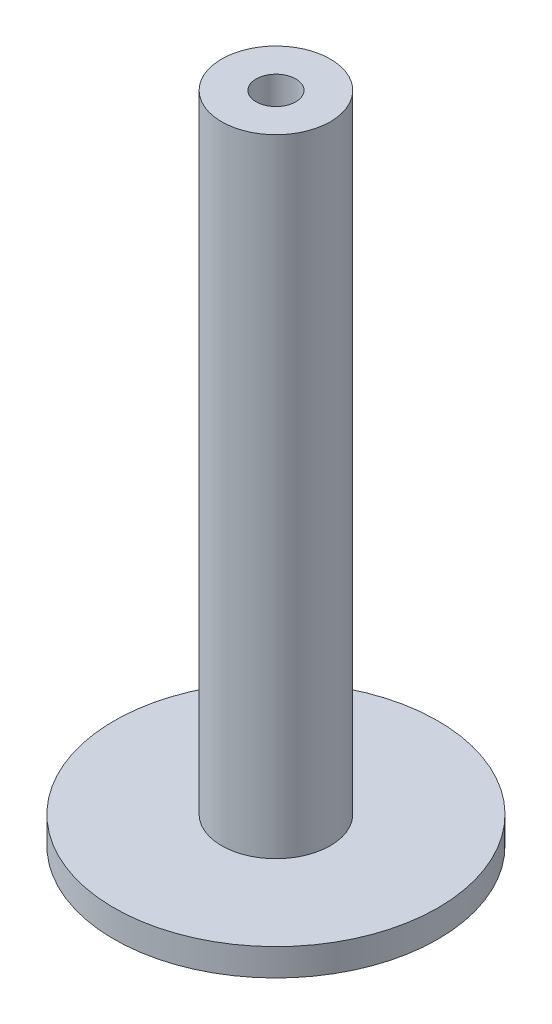
ISO-10303-21;
HEADER;
FILE_DESCRIPTION(('STEP AP214'),'2;1');
FILE_NAME('part.step','',(''),(''),'','','');
FILE_SCHEMA(('AUTOMOTIVE_DESIGN { 1 0 10303 214 1 1 1 1 }'));
ENDSEC;
DATA;
#1=APPLICATION_CONTEXT('core data for automotive mechanical design processes');
#2=APPLICATION_PROTOCOL_DEFINITION('international standard','automotive_design',2000,#1);
#3=PRODUCT_CONTEXT('',#1,'mechanical');
#4=PRODUCT('Part','Part','',(#3));
#5=PRODUCT_RELATED_PRODUCT_CATEGORY('part','',(#4));
#6=PRODUCT_DEFINITION_FORMATION('','',#4);
#7=PRODUCT_DEFINITION_CONTEXT('part definition',#1,'design');
#8=PRODUCT_DEFINITION('design','',#6,#7);
#9=PRODUCT_DEFINITION_SHAPE('','',#8);
#10=(LENGTH_UNIT() NAMED_UNIT(*) SI_UNIT(.MILLI.,.METRE.));
#11=(NAMED_UNIT(*) PLANE_ANGLE_UNIT() SI_UNIT($,.RADIAN.));
#12=(NAMED_UNIT(*) SI_UNIT($,.STERADIAN.) SOLID_ANGLE_UNIT());
#13=UNCERTAINTY_MEASURE_WITH_UNIT(LENGTH_MEASURE(1.E-05),#10,'distance_accuracy_value','');
#14=(GEOMETRIC_REPRESENTATION_CONTEXT(3) GLOBAL_UNCERTAINTY_ASSIGNED_CONTEXT((#13)) GLOBAL_UNIT_ASSIGNED_CONTEXT((#10,
#11,#12)) REPRESENTATION_CONTEXT('',''));
#15=CARTESIAN_POINT('',(0.,0.,0.));
#16=DIRECTION('',(0.,0.,1.));
#17=DIRECTION('',(1.,0.,0.));
#18=AXIS2_PLACEMENT_3D('',#15,#16,#17);
#19=CARTESIAN_POINT('',(0.,1.3,0.));
#20=DIRECTION('',(0.,1.,0.));
#21=DIRECTION('',(0.,0.,1.));
#22=AXIS2_PLACEMENT_3D('',#19,#20,#21);
#23=PLANE('',#22);
#24=CARTESIAN_POINT('',(0.,1.3,0.));
#25=DIRECTION('',(0.,1.,0.));
#26=DIRECTION('',(1.,0.,0.));
#27=AXIS2_PLACEMENT_3D('',#24,#25,#26);
#28=CIRCLE('',#27,7.75);
#29=CARTESIAN_POINT('',(7.75,1.3,0.));
#30=VERTEX_POINT('',#29);
#31=EDGE_CURVE('E11',#30,#30,#28,.T.);
#32=ORIENTED_EDGE('',*,*,#31,.T.);
#33=EDGE_LOOP('',(#32));
#34=FACE_BOUND('',#33,.T.);
#35=CARTESIAN_POINT('',(0.,1.3,0.));
#36=DIRECTION('',(0.,1.,0.));
#37=DIRECTION('',(1.,0.,0.));
#38=AXIS2_PLACEMENT_3D('',#35,#36,#37);
#39=CIRCLE('',#38,2.6);
#40=CARTESIAN_POINT('',(2.6,1.3,0.));
#41=VERTEX_POINT('',#40);
#42=EDGE_CURVE('E63',#41,#41,#39,.T.);
#43=ORIENTED_EDGE('',*,*,#42,.F.);
#44=EDGE_LOOP('',(#43));
#45=FACE_BOUND('',#44,.T.);
#46=ADVANCED_FACE('F47',(#34,#45),#23,.T.);
#47=CARTESIAN_POINT('',(0.,0.,0.));
#48=DIRECTION('',(0.,1.,0.));
#49=DIRECTION('',(0.,0.,1.));
#50=AXIS2_PLACEMENT_3D('',#47,#48,#49);
#51=PLANE('',#50);
#52=CARTESIAN_POINT('',(0.,0.,0.));
#53=DIRECTION('',(0.,1.,0.));
#54=DIRECTION('',(1.,0.,0.));
#55=AXIS2_PLACEMENT_3D('',#52,#53,#54);
#56=CIRCLE('',#55,7.75);
#57=CARTESIAN_POINT('',(7.75,0.,0.));
#58=VERTEX_POINT('',#57);
#59=EDGE_CURVE('E51',#58,#58,#56,.T.);
#60=ORIENTED_EDGE('',*,*,#59,.F.);
#61=EDGE_LOOP('',(#60));
#62=FACE_BOUND('',#61,.T.);
#63=CARTESIAN_POINT('',(0.,0.,0.));
#64=DIRECTION('',(0.,1.,0.));
#65=DIRECTION('',(0.,0.,1.));
#66=AXIS2_PLACEMENT_3D('',#63,#64,#65);
#67=CIRCLE('',#66,0.95);
#68=CARTESIAN_POINT('',(0.,0.,0.95));
#69=VERTEX_POINT('',#68);
#70=EDGE_CURVE('E58',#69,#69,#67,.T.);
#71=ORIENTED_EDGE('',*,*,#70,.T.);
#72=EDGE_LOOP('',(#71));
#73=FACE_BOUND('',#72,.T.);
#74=ADVANCED_FACE('F88',(#62,#73),#51,.F.);
#75=CARTESIAN_POINT('',(0.,1.3,0.));
#76=DIRECTION('',(0.,-1.,0.));
#77=DIRECTION('',(0.,0.,-1.));
#78=AXIS2_PLACEMENT_3D('',#75,#76,#77);
#79=CYLINDRICAL_SURFACE('',#78,7.75);
#80=ORIENTED_EDGE('',*,*,#31,.F.);
#81=EDGE_LOOP('',(#80));
#82=FACE_BOUND('',#81,.T.);
#83=ORIENTED_EDGE('',*,*,#59,.T.);
#84=EDGE_LOOP('',(#83));
#85=FACE_BOUND('',#84,.T.);
#86=ADVANCED_FACE('F49',(#82,#85),#79,.T.);
#87=CARTESIAN_POINT('',(0.,1.3,0.));
#88=DIRECTION('',(0.,-1.,0.));
#89=DIRECTION('',(0.,0.,-1.));
#90=AXIS2_PLACEMENT_3D('',#87,#88,#89);
#91=CYLINDRICAL_SURFACE('',#90,0.95);
#92=ORIENTED_EDGE('',*,*,#70,.F.);
#93=EDGE_LOOP('',(#92));
#94=FACE_BOUND('',#93,.T.);
#95=CARTESIAN_POINT('',(0.,31.3,0.));
#96=DIRECTION('',(0.,1.,0.));
#97=DIRECTION('',(0.,0.,1.));
#98=AXIS2_PLACEMENT_3D('',#95,#96,#97);
#99=CIRCLE('',#98,0.95);
#100=CARTESIAN_POINT('',(0.,31.3,0.95));
#101=VERTEX_POINT('',#100);
#102=EDGE_CURVE('E66',#101,#101,#99,.T.);
#103=ORIENTED_EDGE('',*,*,#102,.T.);
#104=EDGE_LOOP('',(#103));
#105=FACE_BOUND('',#104,.T.);
#106=ADVANCED_FACE('F72',(#94,#105),#91,.F.);
#107=CARTESIAN_POINT('',(0.,31.3,0.));
#108=DIRECTION('',(0.,1.,0.));
#109=DIRECTION('',(0.,0.,1.));
#110=AXIS2_PLACEMENT_3D('',#107,#108,#109);
#111=PLANE('',#110);
#112=CARTESIAN_POINT('',(0.,31.3,0.));
#113=DIRECTION('',(0.,1.,0.));
#114=DIRECTION('',(1.,0.,0.));
#115=AXIS2_PLACEMENT_3D('',#112,#113,#114);
#116=CIRCLE('',#115,2.6);
#117=CARTESIAN_POINT('',(2.6,31.3,0.));
#118=VERTEX_POINT('',#117);
#119=EDGE_CURVE('E62',#118,#118,#116,.T.);
#120=ORIENTED_EDGE('',*,*,#119,.T.);
#121=EDGE_LOOP('',(#120));
#122=FACE_BOUND('',#121,.T.);
#123=ORIENTED_EDGE('',*,*,#102,.F.);
#124=EDGE_LOOP('',(#123));
#125=FACE_BOUND('',#124,.T.);
#126=ADVANCED_FACE('F74',(#122,#125),#111,.T.);
#127=CARTESIAN_POINT('',(0.,31.3,0.));
#128=DIRECTION('',(0.,-1.,0.));
#129=DIRECTION('',(0.,0.,-1.));
#130=AXIS2_PLACEMENT_3D('',#127,#128,#129);
#131=CYLINDRICAL_SURFACE('',#130,2.6);
#132=ORIENTED_EDGE('',*,*,#119,.F.);
#133=EDGE_LOOP('',(#132));
#134=FACE_BOUND('',#133,.T.);
#135=ORIENTED_EDGE('',*,*,#42,.T.);
#136=EDGE_LOOP('',(#135));
#137=FACE_BOUND('',#136,.T.);
#138=ADVANCED_FACE('F76',(#134,#137),#131,.T.);
#139=CLOSED_SHELL('',(#46,#74,#86,#106,#126,#138));
#140=MANIFOLD_SOLID_BREP('B2',#139);
#141=ADVANCED_BREP_SHAPE_REPRESENTATION('',(#18,#140),#14);
#142=SHAPE_DEFINITION_REPRESENTATION(#9,#141);
ENDSEC;
END-ISO-10303-21;
